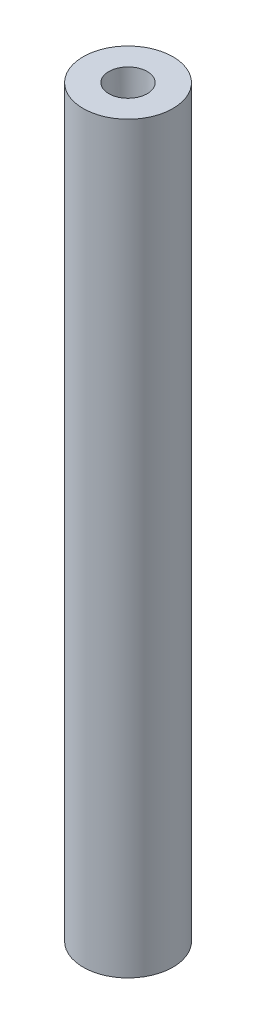
ISO-10303-21;
HEADER;
FILE_DESCRIPTION(('STEP AP214'),'2;1');
FILE_NAME('part.step','',(''),(''),'','','');
FILE_SCHEMA(('AUTOMOTIVE_DESIGN { 1 0 10303 214 1 1 1 1 }'));
ENDSEC;
DATA;
#1=APPLICATION_CONTEXT('core data for automotive mechanical design processes');
#2=APPLICATION_PROTOCOL_DEFINITION('international standard','automotive_design',2000,#1);
#3=PRODUCT_CONTEXT('',#1,'mechanical');
#4=PRODUCT('Part','Part','',(#3));
#5=PRODUCT_RELATED_PRODUCT_CATEGORY('part','',(#4));
#6=PRODUCT_DEFINITION_FORMATION('','',#4);
#7=PRODUCT_DEFINITION_CONTEXT('part definition',#1,'design');
#8=PRODUCT_DEFINITION('design','',#6,#7);
#9=PRODUCT_DEFINITION_SHAPE('','',#8);
#10=(LENGTH_UNIT() NAMED_UNIT(*) SI_UNIT(.MILLI.,.METRE.));
#11=(NAMED_UNIT(*) PLANE_ANGLE_UNIT() SI_UNIT($,.RADIAN.));
#12=(NAMED_UNIT(*) SI_UNIT($,.STERADIAN.) SOLID_ANGLE_UNIT());
#13=UNCERTAINTY_MEASURE_WITH_UNIT(LENGTH_MEASURE(1.E-05),#10,'distance_accuracy_value','');
#14=(GEOMETRIC_REPRESENTATION_CONTEXT(3) GLOBAL_UNCERTAINTY_ASSIGNED_CONTEXT((#13)) GLOBAL_UNIT_ASSIGNED_CONTEXT((#10,
#11,#12)) REPRESENTATION_CONTEXT('',''));
#15=CARTESIAN_POINT('',(0.,0.,0.));
#16=DIRECTION('',(0.,0.,1.));
#17=DIRECTION('',(1.,0.,0.));
#18=AXIS2_PLACEMENT_3D('',#15,#16,#17);
#19=CARTESIAN_POINT('',(0.,58.,0.));
#20=DIRECTION('',(0.,-1.,0.));
#21=DIRECTION('',(0.,0.,-1.));
#22=AXIS2_PLACEMENT_3D('',#19,#20,#21);
#23=CYLINDRICAL_SURFACE('',#22,3.5);
#24=CARTESIAN_POINT('',(0.,58.,0.));
#25=DIRECTION('',(0.,1.,0.));
#26=DIRECTION('',(0.,0.,1.));
#27=AXIS2_PLACEMENT_3D('',#24,#25,#26);
#28=CIRCLE('',#27,3.5);
#29=CARTESIAN_POINT('',(0.,58.,-3.5));
#30=VERTEX_POINT('',#29);
#31=EDGE_CURVE('E11',#30,#30,#28,.T.);
#32=CARTESIAN_POINT('',(0.,0.,0.));
#33=DIRECTION('',(0.,1.,0.));
#34=DIRECTION('',(0.,0.,1.));
#35=AXIS2_PLACEMENT_3D('',#32,#33,#34);
#36=CIRCLE('',#35,3.5);
#37=CARTESIAN_POINT('',(0.,0.,-3.5));
#38=VERTEX_POINT('',#37);
#39=EDGE_CURVE('E38',#38,#38,#36,.T.);
#40=CARTESIAN_POINT('',(0.,58.,-3.5));
#41=CARTESIAN_POINT('',(0.,57.3958333333333,-3.5));
#42=CARTESIAN_POINT('',(0.,56.7916666666667,-3.5));
#43=CARTESIAN_POINT('',(0.,55.5833333333333,-3.5));
#44=CARTESIAN_POINT('',(0.,54.9791666666667,-3.5));
#45=CARTESIAN_POINT('',(0.,53.7708333333333,-3.5));
#46=CARTESIAN_POINT('',(0.,53.1666666666667,-3.5));
#47=CARTESIAN_POINT('',(0.,51.9583333333333,-3.5));
#48=CARTESIAN_POINT('',(0.,51.3541666666667,-3.5));
#49=CARTESIAN_POINT('',(0.,50.1458333333333,-3.5));
#50=CARTESIAN_POINT('',(0.,49.5416666666667,-3.5));
#51=CARTESIAN_POINT('',(0.,48.3333333333333,-3.5));
#52=CARTESIAN_POINT('',(0.,47.7291666666667,-3.5));
#53=CARTESIAN_POINT('',(0.,46.5208333333333,-3.5));
#54=CARTESIAN_POINT('',(0.,45.9166666666667,-3.5));
#55=CARTESIAN_POINT('',(0.,44.7083333333333,-3.5));
#56=CARTESIAN_POINT('',(0.,44.1041666666667,-3.5));
#57=CARTESIAN_POINT('',(0.,42.8958333333333,-3.5));
#58=CARTESIAN_POINT('',(0.,42.2916666666667,-3.5));
#59=CARTESIAN_POINT('',(0.,41.0833333333333,-3.5));
#60=CARTESIAN_POINT('',(0.,40.4791666666667,-3.5));
#61=CARTESIAN_POINT('',(0.,39.2708333333333,-3.5));
#62=CARTESIAN_POINT('',(0.,38.6666666666667,-3.5));
#63=CARTESIAN_POINT('',(0.,37.4583333333333,-3.5));
#64=CARTESIAN_POINT('',(0.,36.8541666666667,-3.5));
#65=CARTESIAN_POINT('',(0.,35.6458333333333,-3.5));
#66=CARTESIAN_POINT('',(0.,35.0416666666667,-3.5));
#67=CARTESIAN_POINT('',(0.,33.8333333333333,-3.5));
#68=CARTESIAN_POINT('',(0.,33.2291666666667,-3.5));
#69=CARTESIAN_POINT('',(0.,32.0208333333333,-3.5));
#70=CARTESIAN_POINT('',(0.,31.4166666666667,-3.5));
#71=CARTESIAN_POINT('',(0.,30.2083333333333,-3.5));
#72=CARTESIAN_POINT('',(0.,29.6041666666667,-3.5));
#73=CARTESIAN_POINT('',(0.,28.3958333333333,-3.5));
#74=CARTESIAN_POINT('',(0.,27.7916666666667,-3.5));
#75=CARTESIAN_POINT('',(0.,26.5833333333333,-3.5));
#76=CARTESIAN_POINT('',(0.,25.9791666666667,-3.5));
#77=CARTESIAN_POINT('',(0.,24.7708333333333,-3.5));
#78=CARTESIAN_POINT('',(0.,24.1666666666667,-3.5));
#79=CARTESIAN_POINT('',(0.,22.9583333333333,-3.5));
#80=CARTESIAN_POINT('',(0.,22.3541666666667,-3.5));
#81=CARTESIAN_POINT('',(0.,21.1458333333333,-3.5));
#82=CARTESIAN_POINT('',(0.,20.5416666666667,-3.5));
#83=CARTESIAN_POINT('',(0.,19.3333333333333,-3.5));
#84=CARTESIAN_POINT('',(0.,18.7291666666667,-3.5));
#85=CARTESIAN_POINT('',(0.,17.5208333333333,-3.5));
#86=CARTESIAN_POINT('',(0.,16.9166666666667,-3.5));
#87=CARTESIAN_POINT('',(0.,15.7083333333333,-3.5));
#88=CARTESIAN_POINT('',(0.,15.1041666666667,-3.5));
#89=CARTESIAN_POINT('',(0.,13.8958333333333,-3.5));
#90=CARTESIAN_POINT('',(0.,13.2916666666667,-3.5));
#91=CARTESIAN_POINT('',(0.,12.0833333333333,-3.5));
#92=CARTESIAN_POINT('',(0.,11.4791666666667,-3.5));
#93=CARTESIAN_POINT('',(0.,10.2708333333333,-3.5));
#94=CARTESIAN_POINT('',(0.,9.66666666666667,-3.5));
#95=CARTESIAN_POINT('',(0.,8.45833333333333,-3.5));
#96=CARTESIAN_POINT('',(0.,7.85416666666667,-3.5));
#97=CARTESIAN_POINT('',(0.,6.64583333333333,-3.5));
#98=CARTESIAN_POINT('',(0.,6.04166666666667,-3.5));
#99=CARTESIAN_POINT('',(0.,4.83333333333333,-3.5));
#100=CARTESIAN_POINT('',(0.,4.22916666666667,-3.5));
#101=CARTESIAN_POINT('',(0.,3.02083333333334,-3.5));
#102=CARTESIAN_POINT('',(0.,2.41666666666667,-3.5));
#103=CARTESIAN_POINT('',(0.,1.20833333333333,-3.5));
#104=CARTESIAN_POINT('',(0.,0.604166666666666,-3.5));
#105=CARTESIAN_POINT('',(0.,0.,-3.5));
#106=B_SPLINE_CURVE_WITH_KNOTS('',3,(#40,#41,#42,#43,#44,#45,#46,#47,#48,#49,#50,#51,#52,#53,
#54,#55,#56,#57,#58,#59,#60,#61,#62,#63,#64,#65,#66,#67,#68,#69,#70,#71,#72,#73,#74,#75,#76,#77,
#78,#79,#80,#81,#82,#83,#84,#85,#86,#87,#88,#89,#90,#91,#92,#93,#94,#95,#96,#97,#98,#99,#100,
#101,#102,#103,#104,#105),.UNSPECIFIED.,.F.,.F.,(4,2,2,2,2,2,2,2,2,2,2,2,2,2,2,2,2,2,2,2,2,2,2,
2,2,2,2,2,2,2,2,2,4),(0.,1.8125,3.625,5.4375,7.25000000000001,9.0625,10.875,12.6875,14.5,
16.3125,18.125,19.9375,21.75,23.5625,25.375,27.1875,29.,30.8125,32.625,34.4375,36.25,38.0625,
39.875,41.6875,43.5,45.3125,47.125,48.9375,50.75,52.5625,54.375,56.1875,58.),.UNSPECIFIED.);
#107=EDGE_CURVE('BSEAM35',#30,#38,#106,.T.);
#108=ORIENTED_EDGE('',*,*,#31,.F.);
#109=ORIENTED_EDGE('',*,*,#39,.T.);
#110=ORIENTED_EDGE('',*,*,#107,.T.);
#111=ORIENTED_EDGE('',*,*,#107,.F.);
#112=EDGE_LOOP('',(#108,#110,#109,#111));
#113=FACE_BOUND('',#112,.T.);
#114=ADVANCED_FACE('F35',(#113),#23,.T.);
#115=CARTESIAN_POINT('',(0.,58.,0.));
#116=DIRECTION('',(0.,1.,0.));
#117=DIRECTION('',(0.,0.,1.));
#118=AXIS2_PLACEMENT_3D('',#115,#116,#117);
#119=PLANE('',#118);
#120=CARTESIAN_POINT('',(0.,58.,0.));
#121=DIRECTION('',(0.,1.,0.));
#122=DIRECTION('',(0.,0.,1.));
#123=AXIS2_PLACEMENT_3D('',#120,#121,#122);
#124=CIRCLE('',#123,1.5);
#125=CARTESIAN_POINT('',(-1.09022169823036,58.,1.03025076981661));
#126=VERTEX_POINT('',#125);
#127=EDGE_CURVE('E51',#126,#126,#124,.T.);
#128=ORIENTED_EDGE('',*,*,#127,.F.);
#129=EDGE_LOOP('',(#128));
#130=FACE_BOUND('',#129,.T.);
#131=ORIENTED_EDGE('',*,*,#31,.T.);
#132=EDGE_LOOP('',(#131));
#133=FACE_BOUND('',#132,.T.);
#134=ADVANCED_FACE('F74',(#130,#133),#119,.T.);
#135=CARTESIAN_POINT('',(0.,0.,0.));
#136=DIRECTION('',(0.,1.,0.));
#137=DIRECTION('',(0.,0.,1.));
#138=AXIS2_PLACEMENT_3D('',#135,#136,#137);
#139=PLANE('',#138);
#140=CARTESIAN_POINT('',(0.,0.,0.));
#141=DIRECTION('',(0.,-1.,0.));
#142=DIRECTION('',(0.,0.,-1.));
#143=AXIS2_PLACEMENT_3D('',#140,#141,#142);
#144=CIRCLE('',#143,1.3);
#145=CARTESIAN_POINT('',(0.0628701517894967,0.,1.29847885774623));
#146=VERTEX_POINT('',#145);
#147=EDGE_CURVE('E133',#146,#146,#144,.T.);
#148=ORIENTED_EDGE('',*,*,#147,.F.);
#149=EDGE_LOOP('',(#148));
#150=FACE_BOUND('',#149,.T.);
#151=ORIENTED_EDGE('',*,*,#39,.F.);
#152=EDGE_LOOP('',(#151));
#153=FACE_BOUND('',#152,.T.);
#154=ADVANCED_FACE('F68',(#150,#153),#139,.F.);
#155=CARTESIAN_POINT('',(0.,29.,0.));
#156=DIRECTION('',(0.,1.,0.));
#157=DIRECTION('',(0.,0.,1.));
#158=AXIS2_PLACEMENT_3D('',#155,#156,#157);
#159=PLANE('',#158);
#160=CARTESIAN_POINT('',(0.,29.,0.));
#161=DIRECTION('',(0.,1.,0.));
#162=DIRECTION('',(0.,0.,1.));
#163=AXIS2_PLACEMENT_3D('',#160,#161,#162);
#164=CIRCLE('',#163,1.3);
#165=CARTESIAN_POINT('',(-0.294735094204618,29.,1.26614818415705));
#166=VERTEX_POINT('',#165);
#167=EDGE_CURVE('E136',#166,#166,#164,.T.);
#168=ORIENTED_EDGE('',*,*,#167,.F.);
#169=EDGE_LOOP('',(#168));
#170=FACE_BOUND('',#169,.T.);
#171=CARTESIAN_POINT('',(0.,29.,0.));
#172=DIRECTION('',(0.,1.,0.));
#173=DIRECTION('',(0.,0.,1.));
#174=AXIS2_PLACEMENT_3D('',#171,#172,#173);
#175=CIRCLE('',#174,1.5);
#176=CARTESIAN_POINT('',(-1.42946901227583,29.,-0.454552904449162));
#177=VERTEX_POINT('',#176);
#178=EDGE_CURVE('E45',#177,#177,#175,.T.);
#179=ORIENTED_EDGE('',*,*,#178,.T.);
#180=EDGE_LOOP('',(#179));
#181=FACE_BOUND('',#180,.T.);
#182=ADVANCED_FACE('F57',(#170,#181),#159,.T.);
#183=CARTESIAN_POINT('',(-1.09022169823036,58.,1.03025076981661));
#184=CARTESIAN_POINT('',(-1.42946901227583,29.,-0.454552904449162));
#185=CARTESIAN_POINT('',(-3.15072323786358,58.,-1.1501926266441));
#186=CARTESIAN_POINT('',(-0.520363203377505,29.,-3.31349092900082));
#187=CARTESIAN_POINT('',(-0.970279841402867,58.,-3.21069416627732));
#188=CARTESIAN_POINT('',(2.33857482117415,29.,-2.40438512010249));
#189=CARTESIAN_POINT('',(1.09022169823036,58.,-1.03025076981661));
#190=CARTESIAN_POINT('',(1.42946901227583,29.,0.454552904449162));
#191=CARTESIAN_POINT('',(3.15072323786358,58.,1.1501926266441));
#192=CARTESIAN_POINT('',(0.520363203377506,29.,3.31349092900082));
#193=CARTESIAN_POINT('',(0.970279841402868,58.,3.21069416627732));
#194=CARTESIAN_POINT('',(-2.33857482117415,29.,2.40438512010249));
#195=CARTESIAN_POINT('',(-1.09022169823036,58.,1.03025076981661));
#196=CARTESIAN_POINT('',(-1.42946901227583,29.,-0.454552904449162));
#197=(BOUNDED_SURFACE() B_SPLINE_SURFACE(3,1,((#183,#184),(#185,#186),(#187,#188),(#189,#190),
(#191,#192),(#193,#194),(#195,#196)),.UNSPECIFIED.,.T.,.F.,.F.) B_SPLINE_SURFACE_WITH_KNOTS((4,
3,4),(2,2),(0.,0.5,1.),(0.,1.),
.UNSPECIFIED.) GEOMETRIC_REPRESENTATION_ITEM() RATIONAL_B_SPLINE_SURFACE(((1.,1.),
(0.333333333333333,0.333333333333333),(0.333333333333333,0.333333333333333),(1.,1.),
(0.333333333333334,0.333333333333334),(0.333333333333334,0.333333333333334),(1.,1.))) REPRESENTATION_ITEM('') SURFACE());
#198=CARTESIAN_POINT('',(-1.09022169823036,58.,1.03025076981661));
#199=CARTESIAN_POINT('',(-1.09375552441833,57.6979166666667,1.01478406487634));
#200=CARTESIAN_POINT('',(-1.0972893506063,57.3958333333333,0.999317359936075));
#201=CARTESIAN_POINT('',(-1.10435700298225,56.7916666666667,0.968383950055537));
#202=CARTESIAN_POINT('',(-1.10789082917022,56.4895833333333,0.952917245115269));
#203=CARTESIAN_POINT('',(-1.11495848154617,55.8854166666667,0.921983835234732));
#204=CARTESIAN_POINT('',(-1.11849230773414,55.5833333333333,0.906517130294463));
#205=CARTESIAN_POINT('',(-1.12555996011009,54.9791666666667,0.875583720413927));
#206=CARTESIAN_POINT('',(-1.12909378629807,54.6770833333333,0.860117015473658));
#207=CARTESIAN_POINT('',(-1.13616143867401,54.0729166666667,0.829183605593121));
#208=CARTESIAN_POINT('',(-1.13969526486199,53.7708333333333,0.813716900652853));
#209=CARTESIAN_POINT('',(-1.14676291723793,53.1666666666667,0.782783490772316));
#210=CARTESIAN_POINT('',(-1.15029674342591,52.8645833333333,0.767316785832047));
#211=CARTESIAN_POINT('',(-1.15736439580186,52.2604166666667,0.73638337595151));
#212=CARTESIAN_POINT('',(-1.16089822198983,51.9583333333333,0.720916671011242));
#213=CARTESIAN_POINT('',(-1.16796587436578,51.3541666666667,0.689983261130705));
#214=CARTESIAN_POINT('',(-1.17149970055375,51.0520833333333,0.674516556190436));
#215=CARTESIAN_POINT('',(-1.1785673529297,50.4479166666667,0.6435831463099));
#216=CARTESIAN_POINT('',(-1.18210117911767,50.1458333333333,0.628116441369631));
#217=CARTESIAN_POINT('',(-1.18916883149362,49.5416666666667,0.597183031489094));
#218=CARTESIAN_POINT('',(-1.19270265768159,49.2395833333333,0.581716326548826));
#219=CARTESIAN_POINT('',(-1.19977031005754,48.6354166666667,0.550782916668289));
#220=CARTESIAN_POINT('',(-1.20330413624551,48.3333333333333,0.53531621172802));
#221=CARTESIAN_POINT('',(-1.21037178862146,47.7291666666667,0.504382801847483));
#222=CARTESIAN_POINT('',(-1.21390561480943,47.4270833333333,0.488916096907215));
#223=CARTESIAN_POINT('',(-1.22097326718538,46.8229166666667,0.457982687026678));
#224=CARTESIAN_POINT('',(-1.22450709337336,46.5208333333333,0.442515982086409));
#225=CARTESIAN_POINT('',(-1.2315747457493,45.9166666666667,0.411582572205872));
#226=CARTESIAN_POINT('',(-1.23510857193728,45.6145833333333,0.396115867265604));
#227=CARTESIAN_POINT('',(-1.24217622431322,45.0104166666667,0.365182457385067));
#228=CARTESIAN_POINT('',(-1.2457100505012,44.7083333333333,0.349715752444799));
#229=CARTESIAN_POINT('',(-1.25277770287714,44.1041666666667,0.318782342564262));
#230=CARTESIAN_POINT('',(-1.25631152906512,43.8020833333333,0.303315637623993));
#231=CARTESIAN_POINT('',(-1.26337918144107,43.1979166666667,0.272382227743456));
#232=CARTESIAN_POINT('',(-1.26691300762904,42.8958333333333,0.256915522803188));
#233=CARTESIAN_POINT('',(-1.27398066000499,42.2916666666667,0.225982112922651));
#234=CARTESIAN_POINT('',(-1.27751448619296,41.9895833333333,0.210515407982382));
#235=CARTESIAN_POINT('',(-1.28458213856891,41.3854166666667,0.179581998101845));
#236=CARTESIAN_POINT('',(-1.28811596475688,41.0833333333333,0.164115293161577));
#237=CARTESIAN_POINT('',(-1.29518361713283,40.4791666666667,0.13318188328104));
#238=CARTESIAN_POINT('',(-1.2987174433208,40.1770833333333,0.117715178340771));
#239=CARTESIAN_POINT('',(-1.30578509569675,39.5729166666667,0.0867817684602345));
#240=CARTESIAN_POINT('',(-1.30931892188472,39.2708333333333,0.0713150635199662));
#241=CARTESIAN_POINT('',(-1.31638657426067,38.6666666666667,0.0403816536394294));
#242=CARTESIAN_POINT('',(-1.31992040044864,38.3645833333333,0.0249149486991608));
#243=CARTESIAN_POINT('',(-1.32698805282459,37.7604166666667,-0.00601846118137626));
#244=CARTESIAN_POINT('',(-1.33052187901257,37.4583333333333,-0.0214851661216447));
#245=CARTESIAN_POINT('',(-1.33758953138851,36.8541666666667,-0.0524185760021816));
#246=CARTESIAN_POINT('',(-1.34112335757649,36.5520833333333,-0.0678852809424501));
#247=CARTESIAN_POINT('',(-1.34819100995243,35.9479166666667,-0.0988186908229871));
#248=CARTESIAN_POINT('',(-1.35172483614041,35.6458333333333,-0.114285395763256));
#249=CARTESIAN_POINT('',(-1.35879248851635,35.0416666666667,-0.145218805643793));
#250=CARTESIAN_POINT('',(-1.36232631470433,34.7395833333333,-0.160685510584061));
#251=CARTESIAN_POINT('',(-1.36939396708028,34.1354166666667,-0.191618920464598));
#252=CARTESIAN_POINT('',(-1.37292779326825,33.8333333333333,-0.207085625404866));
#253=CARTESIAN_POINT('',(-1.3799954456442,33.2291666666667,-0.238019035285403));
#254=CARTESIAN_POINT('',(-1.38352927183217,32.9270833333333,-0.253485740225672));
#255=CARTESIAN_POINT('',(-1.39059692420812,32.3229166666667,-0.284419150106209));
#256=CARTESIAN_POINT('',(-1.39413075039609,32.0208333333333,-0.299885855046477));
#257=CARTESIAN_POINT('',(-1.40119840277204,31.4166666666667,-0.330819264927014));
#258=CARTESIAN_POINT('',(-1.40473222896001,31.1145833333333,-0.346285969867282));
#259=CARTESIAN_POINT('',(-1.41179988133596,30.5104166666667,-0.377219379747819));
#260=CARTESIAN_POINT('',(-1.41533370752393,30.2083333333333,-0.392686084688088));
#261=CARTESIAN_POINT('',(-1.42240135989988,29.6041666666667,-0.423619494568625));
#262=CARTESIAN_POINT('',(-1.42593518608785,29.3020833333333,-0.439086199508893));
#263=CARTESIAN_POINT('',(-1.42946901227583,29.,-0.454552904449162));
#264=B_SPLINE_CURVE_WITH_KNOTS('',3,(#198,#199,#200,#201,#202,#203,#204,#205,#206,#207,#208,
#209,#210,#211,#212,#213,#214,#215,#216,#217,#218,#219,#220,#221,#222,#223,#224,#225,#226,#227,
#228,#229,#230,#231,#232,#233,#234,#235,#236,#237,#238,#239,#240,#241,#242,#243,#244,#245,#246,
#247,#248,#249,#250,#251,#252,#253,#254,#255,#256,#257,#258,#259,#260,#261,#262,#263),
.UNSPECIFIED.,.F.,.F.,(4,2,2,2,2,2,2,2,2,2,2,2,2,2,2,2,2,2,2,2,2,2,2,2,2,2,2,2,2,2,2,2,4),(0.,
0.907498994216045,1.81499798843208,2.72249698264812,3.62999597686416,4.5374949710802,
5.44499396529625,6.35249295951228,7.25999195372833,8.16749094794436,9.07498994216041,
9.98248893637645,10.8899879305925,11.7974869248085,12.7049859190246,13.6124849132406,
14.5199839074566,15.4274829016727,16.3349818958887,17.2424808901048,18.1499798843208,
19.0574788785369,19.9649778727529,20.8724768669689,21.779975861185,22.687474855401,
23.5949738496171,24.5024728438331,25.4099718380491,26.3174708322652,27.2249698264812,
28.1324688206973,29.0399678149133),.UNSPECIFIED.);
#265=EDGE_CURVE('BSEAM67',#126,#177,#264,.T.);
#266=ORIENTED_EDGE('',*,*,#127,.T.);
#267=ORIENTED_EDGE('',*,*,#178,.F.);
#268=ORIENTED_EDGE('',*,*,#265,.T.);
#269=ORIENTED_EDGE('',*,*,#265,.F.);
#270=EDGE_LOOP('',(#266,#268,#267,#269));
#271=FACE_BOUND('',#270,.T.);
#272=ADVANCED_FACE('F67',(#271),#197,.F.);
#273=CARTESIAN_POINT('',(0.0628701517894967,0.,1.29847885774623));
#274=CARTESIAN_POINT('',(-0.294735094204618,29.,1.26614818415705));
#275=CARTESIAN_POINT('',(2.65982786728196,0.,1.17273855416724));
#276=CARTESIAN_POINT('',(2.23756127410948,29.,1.85561837256629));
#277=CARTESIAN_POINT('',(2.53408756370297,0.,-1.42421916132523));
#278=CARTESIAN_POINT('',(2.82703146251872,29.,-0.676677995747812));
#279=CARTESIAN_POINT('',(-0.0628701517894969,0.,-1.29847885774623));
#280=CARTESIAN_POINT('',(0.294735094204619,29.,-1.26614818415705));
#281=CARTESIAN_POINT('',(-2.65982786728196,0.,-1.17273855416724));
#282=CARTESIAN_POINT('',(-2.23756127410948,29.,-1.85561837256629));
#283=CARTESIAN_POINT('',(-2.53408756370297,0.,1.42421916132523));
#284=CARTESIAN_POINT('',(-2.82703146251872,29.,0.676677995747811));
#285=CARTESIAN_POINT('',(0.0628701517894967,0.,1.29847885774623));
#286=CARTESIAN_POINT('',(-0.294735094204618,29.,1.26614818415705));
#287=(BOUNDED_SURFACE() B_SPLINE_SURFACE(3,1,((#273,#274),(#275,#276),(#277,#278),(#279,#280),
(#281,#282),(#283,#284),(#285,#286)),.UNSPECIFIED.,.T.,.F.,.F.) B_SPLINE_SURFACE_WITH_KNOTS((4,
3,4),(2,2),(0.,0.5,1.),(0.,1.),
.UNSPECIFIED.) GEOMETRIC_REPRESENTATION_ITEM() RATIONAL_B_SPLINE_SURFACE(((1.,1.),
(0.333333333333333,0.333333333333334),(0.333333333333333,0.333333333333334),(1.,1.),
(0.333333333333334,0.333333333333333),(0.333333333333334,0.333333333333333),(1.,1.))) REPRESENTATION_ITEM('') SURFACE());
#288=CARTESIAN_POINT('',(0.0628701517894967,0.,1.29847885774623));
#289=CARTESIAN_POINT('',(0.0591450971437247,0.302083333333334,1.29814207989635));
#290=CARTESIAN_POINT('',(0.0554200424979527,0.604166666666667,1.29780530204646));
#291=CARTESIAN_POINT('',(0.0479699332064086,1.20833333333333,1.29713174634668));
#292=CARTESIAN_POINT('',(0.0442448785606366,1.51041666666667,1.2967949684968));
#293=CARTESIAN_POINT('',(0.0367947692690925,2.11458333333333,1.29612141279702));
#294=CARTESIAN_POINT('',(0.0330697146233205,2.41666666666667,1.29578463494714));
#295=CARTESIAN_POINT('',(0.0256196053317764,3.02083333333333,1.29511107924736));
#296=CARTESIAN_POINT('',(0.0218945506860044,3.32291666666667,1.29477430139747));
#297=CARTESIAN_POINT('',(0.0144444413944603,3.92708333333333,1.2941007456977));
#298=CARTESIAN_POINT('',(0.0107193867486883,4.22916666666667,1.29376396784781));
#299=CARTESIAN_POINT('',(0.00326927745714425,4.83333333333333,1.29309041214804));
#300=CARTESIAN_POINT('',(-0.000455777188627785,5.13541666666667,1.29275363429815));
#301=CARTESIAN_POINT('',(-0.00790588648017184,5.73958333333333,1.29208007859838));
#302=CARTESIAN_POINT('',(-0.0116309411259439,6.04166666666667,1.29174330074849));
#303=CARTESIAN_POINT('',(-0.0190810504174879,6.64583333333333,1.29106974504871));
#304=CARTESIAN_POINT('',(-0.02280610506326,6.94791666666667,1.29073296719883));
#305=CARTESIAN_POINT('',(-0.030256214354804,7.55208333333333,1.29005941149905));
#306=CARTESIAN_POINT('',(-0.033981269000576,7.85416666666667,1.28972263364916));
#307=CARTESIAN_POINT('',(-0.0414313782921201,8.45833333333333,1.28904907794939));
#308=CARTESIAN_POINT('',(-0.0451564329378921,8.76041666666667,1.2887123000995));
#309=CARTESIAN_POINT('',(-0.0526065422294362,9.36458333333333,1.28803874439973));
#310=CARTESIAN_POINT('',(-0.0563315968752082,9.66666666666667,1.28770196654984));
#311=CARTESIAN_POINT('',(-0.0637817061667523,10.2708333333333,1.28702841085006));
#312=CARTESIAN_POINT('',(-0.0675067608125243,10.5729166666667,1.28669163300018));
#313=CARTESIAN_POINT('',(-0.0749568701040684,11.1770833333333,1.2860180773004));
#314=CARTESIAN_POINT('',(-0.0786819247498404,11.4791666666667,1.28568129945052));
#315=CARTESIAN_POINT('',(-0.0861320340413844,12.0833333333333,1.28500774375074));
#316=CARTESIAN_POINT('',(-0.0898570886871565,12.3854166666667,1.28467096590085));
#317=CARTESIAN_POINT('',(-0.0973071979787005,12.9895833333333,1.28399741020108));
#318=CARTESIAN_POINT('',(-0.101032252624473,13.2916666666667,1.28366063235119));
#319=CARTESIAN_POINT('',(-0.108482361916017,13.8958333333333,1.28298707665142));
#320=CARTESIAN_POINT('',(-0.112207416561789,14.1979166666667,1.28265029880153));
#321=CARTESIAN_POINT('',(-0.119657525853333,14.8020833333333,1.28197674310175));
#322=CARTESIAN_POINT('',(-0.123382580499105,15.1041666666667,1.28163996525187));
#323=CARTESIAN_POINT('',(-0.130832689790649,15.7083333333333,1.28096640955209));
#324=CARTESIAN_POINT('',(-0.134557744436421,16.0104166666667,1.28062963170221));
#325=CARTESIAN_POINT('',(-0.142007853727965,16.6145833333333,1.27995607600243));
#326=CARTESIAN_POINT('',(-0.145732908373737,16.9166666666667,1.27961929815254));
#327=CARTESIAN_POINT('',(-0.153183017665281,17.5208333333333,1.27894574245277));
#328=CARTESIAN_POINT('',(-0.156908072311053,17.8229166666667,1.27860896460288));
#329=CARTESIAN_POINT('',(-0.164358181602597,18.4270833333333,1.27793540890311));
#330=CARTESIAN_POINT('',(-0.168083236248369,18.7291666666667,1.27759863105322));
#331=CARTESIAN_POINT('',(-0.175533345539913,19.3333333333333,1.27692507535344));
#332=CARTESIAN_POINT('',(-0.179258400185685,19.6354166666667,1.27658829750356));
#333=CARTESIAN_POINT('',(-0.186708509477229,20.2395833333333,1.27591474180378));
#334=CARTESIAN_POINT('',(-0.190433564123001,20.5416666666667,1.2755779639539));
#335=CARTESIAN_POINT('',(-0.197883673414545,21.1458333333333,1.27490440825412));
#336=CARTESIAN_POINT('',(-0.201608728060317,21.4479166666667,1.27456763040423));
#337=CARTESIAN_POINT('',(-0.209058837351861,22.0520833333333,1.27389407470446));
#338=CARTESIAN_POINT('',(-0.212783891997633,22.3541666666667,1.27355729685457));
#339=CARTESIAN_POINT('',(-0.220234001289178,22.9583333333333,1.2728837411548));
#340=CARTESIAN_POINT('',(-0.22395905593495,23.2604166666667,1.27254696330491));
#341=CARTESIAN_POINT('',(-0.231409165226494,23.8645833333333,1.27187340760513));
#342=CARTESIAN_POINT('',(-0.235134219872266,24.1666666666667,1.27153662975525));
#343=CARTESIAN_POINT('',(-0.24258432916381,24.7708333333333,1.27086307405547));
#344=CARTESIAN_POINT('',(-0.246309383809582,25.0729166666667,1.27052629620559));
#345=CARTESIAN_POINT('',(-0.253759493101126,25.6770833333333,1.26985274050581));
#346=CARTESIAN_POINT('',(-0.257484547746898,25.9791666666667,1.26951596265592));
#347=CARTESIAN_POINT('',(-0.264934657038442,26.5833333333333,1.26884240695615));
#348=CARTESIAN_POINT('',(-0.268659711684214,26.8854166666667,1.26850562910626));
#349=CARTESIAN_POINT('',(-0.276109820975758,27.4895833333333,1.26783207340649));
#350=CARTESIAN_POINT('',(-0.27983487562153,27.7916666666667,1.2674952955566));
#351=CARTESIAN_POINT('',(-0.287284984913074,28.3958333333333,1.26682173985682));
#352=CARTESIAN_POINT('',(-0.291010039558846,28.6979166666667,1.26648496200694));
#353=CARTESIAN_POINT('',(-0.294735094204618,29.,1.26614818415705));
#354=B_SPLINE_CURVE_WITH_KNOTS('',3,(#288,#289,#290,#291,#292,#293,#294,#295,#296,#297,#298,
#299,#300,#301,#302,#303,#304,#305,#306,#307,#308,#309,#310,#311,#312,#313,#314,#315,#316,#317,
#318,#319,#320,#321,#322,#323,#324,#325,#326,#327,#328,#329,#330,#331,#332,#333,#334,#335,#336,
#337,#338,#339,#340,#341,#342,#343,#344,#345,#346,#347,#348,#349,#350,#351,#352,#353),
.UNSPECIFIED.,.F.,.F.,(4,2,2,2,2,2,2,2,2,2,2,2,2,2,2,2,2,2,2,2,2,2,2,2,2,2,2,2,2,2,2,2,4),(0.,
0.906319462200226,1.81263892440045,2.71895838660068,3.62527784880091,4.53159731100113,
5.43791677320136,6.34423623540158,7.25055569760181,8.15687515980204,9.06319462200226,
9.96951408420249,10.8758335464027,11.7821530086029,12.6884724708032,13.5947919330034,
14.5011113952036,15.4074308574038,16.3137503196041,17.2200697818043,18.1263892440045,
19.0327087062048,19.939028168405,20.8453476306052,21.7516670928054,22.6579865550057,
23.5643060172059,24.4706254794061,25.3769449416064,26.2832644038066,27.1895838660068,
28.095903328207,29.0022227904073),.UNSPECIFIED.);
#355=EDGE_CURVE('BSEAM102',#146,#166,#354,.T.);
#356=ORIENTED_EDGE('',*,*,#147,.T.);
#357=ORIENTED_EDGE('',*,*,#167,.T.);
#358=ORIENTED_EDGE('',*,*,#355,.T.);
#359=ORIENTED_EDGE('',*,*,#355,.F.);
#360=EDGE_LOOP('',(#356,#358,#357,#359));
#361=FACE_BOUND('',#360,.T.);
#362=ADVANCED_FACE('F102',(#361),#287,.F.);
#363=CLOSED_SHELL('',(#114,#134,#154,#182,#272,#362));
#364=MANIFOLD_SOLID_BREP('B2',#363);
#365=ADVANCED_BREP_SHAPE_REPRESENTATION('',(#18,#364),#14);
#366=SHAPE_DEFINITION_REPRESENTATION(#9,#365);
ENDSEC;
END-ISO-10303-21;
